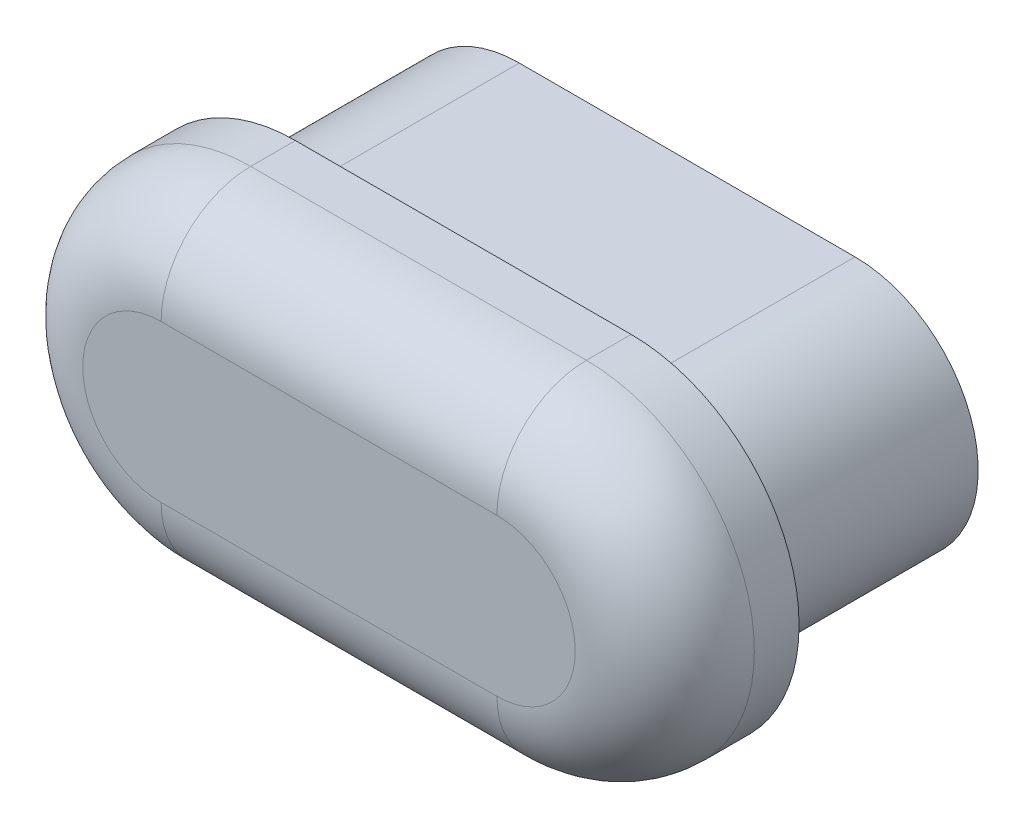
ISO-10303-21;
HEADER;
FILE_DESCRIPTION(('STEP AP214'),'2;1');
FILE_NAME('part.step','',(''),(''),'','','');
FILE_SCHEMA(('AUTOMOTIVE_DESIGN { 1 0 10303 214 1 1 1 1 }'));
ENDSEC;
DATA;
#1=APPLICATION_CONTEXT('core data for automotive mechanical design processes');
#2=APPLICATION_PROTOCOL_DEFINITION('international standard','automotive_design',2000,#1);
#3=PRODUCT_CONTEXT('',#1,'mechanical');
#4=PRODUCT('Part','Part','',(#3));
#5=PRODUCT_RELATED_PRODUCT_CATEGORY('part','',(#4));
#6=PRODUCT_DEFINITION_FORMATION('','',#4);
#7=PRODUCT_DEFINITION_CONTEXT('part definition',#1,'design');
#8=PRODUCT_DEFINITION('design','',#6,#7);
#9=PRODUCT_DEFINITION_SHAPE('','',#8);
#10=(LENGTH_UNIT() NAMED_UNIT(*) SI_UNIT(.MILLI.,.METRE.));
#11=(NAMED_UNIT(*) PLANE_ANGLE_UNIT() SI_UNIT($,.RADIAN.));
#12=(NAMED_UNIT(*) SI_UNIT($,.STERADIAN.) SOLID_ANGLE_UNIT());
#13=UNCERTAINTY_MEASURE_WITH_UNIT(LENGTH_MEASURE(1.E-05),#10,'distance_accuracy_value','');
#14=(GEOMETRIC_REPRESENTATION_CONTEXT(3) GLOBAL_UNCERTAINTY_ASSIGNED_CONTEXT((#13)) GLOBAL_UNIT_ASSIGNED_CONTEXT((#10,
#11,#12)) REPRESENTATION_CONTEXT('',''));
#15=CARTESIAN_POINT('',(0.,0.,0.));
#16=DIRECTION('',(0.,0.,1.));
#17=DIRECTION('',(1.,0.,0.));
#18=AXIS2_PLACEMENT_3D('',#15,#16,#17);
#19=CARTESIAN_POINT('',(-7.5,0.,0.));
#20=DIRECTION('',(0.,0.,1.));
#21=DIRECTION('',(1.,0.,0.));
#22=AXIS2_PLACEMENT_3D('',#19,#20,#21);
#23=PLANE('',#22);
#24=CARTESIAN_POINT('',(-7.5,0.,0.));
#25=DIRECTION('',(0.,0.,1.));
#26=DIRECTION('',(1.,0.,0.));
#27=AXIS2_PLACEMENT_3D('',#24,#25,#26);
#28=CIRCLE('',#27,7.5);
#29=CARTESIAN_POINT('',(-7.5,7.5,0.));
#30=VERTEX_POINT('',#29);
#31=CARTESIAN_POINT('',(-7.5,-7.5,0.));
#32=VERTEX_POINT('',#31);
#33=EDGE_CURVE('E139',#30,#32,#28,.T.);
#34=ORIENTED_EDGE('',*,*,#33,.F.);
#35=DIRECTION('',(-1.,0.,0.));
#36=VECTOR('',#35,1.);
#37=CARTESIAN_POINT('',(-7.5,7.5,0.));
#38=LINE('',#37,#36);
#39=CARTESIAN_POINT('',(7.5,7.5,0.));
#40=VERTEX_POINT('',#39);
#41=EDGE_CURVE('E153',#40,#30,#38,.T.);
#42=ORIENTED_EDGE('',*,*,#41,.F.);
#43=CARTESIAN_POINT('',(7.5,0.,0.));
#44=DIRECTION('',(0.,0.,1.));
#45=DIRECTION('',(1.,0.,0.));
#46=AXIS2_PLACEMENT_3D('',#43,#44,#45);
#47=CIRCLE('',#46,7.5);
#48=CARTESIAN_POINT('',(7.5,-7.5,0.));
#49=VERTEX_POINT('',#48);
#50=EDGE_CURVE('E150',#49,#40,#47,.T.);
#51=ORIENTED_EDGE('',*,*,#50,.F.);
#52=DIRECTION('',(1.,0.,0.));
#53=VECTOR('',#52,1.);
#54=CARTESIAN_POINT('',(-7.5,-7.5,0.));
#55=LINE('',#54,#53);
#56=EDGE_CURVE('E142',#32,#49,#55,.T.);
#57=ORIENTED_EDGE('',*,*,#56,.F.);
#58=EDGE_LOOP('',(#34,#42,#51,#57));
#59=FACE_BOUND('',#58,.T.);
#60=CARTESIAN_POINT('',(-7.5,0.,0.));
#61=DIRECTION('',(0.,0.,-1.));
#62=DIRECTION('',(-1.,0.,0.));
#63=AXIS2_PLACEMENT_3D('',#60,#61,#62);
#64=CIRCLE('',#63,5.5);
#65=CARTESIAN_POINT('',(-7.5,-5.5,0.));
#66=VERTEX_POINT('',#65);
#67=CARTESIAN_POINT('',(-7.5,5.5,0.));
#68=VERTEX_POINT('',#67);
#69=EDGE_CURVE('E138',#66,#68,#64,.T.);
#70=ORIENTED_EDGE('',*,*,#69,.F.);
#71=DIRECTION('',(-1.,0.,0.));
#72=VECTOR('',#71,1.);
#73=CARTESIAN_POINT('',(7.5,-5.5,0.));
#74=LINE('',#73,#72);
#75=CARTESIAN_POINT('',(7.5,-5.5,0.));
#76=VERTEX_POINT('',#75);
#77=EDGE_CURVE('E135',#76,#66,#74,.T.);
#78=ORIENTED_EDGE('',*,*,#77,.F.);
#79=CARTESIAN_POINT('',(7.5,0.,0.));
#80=DIRECTION('',(0.,0.,-1.));
#81=DIRECTION('',(-1.,0.,0.));
#82=AXIS2_PLACEMENT_3D('',#79,#80,#81);
#83=CIRCLE('',#82,5.5);
#84=CARTESIAN_POINT('',(7.5,5.5,0.));
#85=VERTEX_POINT('',#84);
#86=EDGE_CURVE('E193',#85,#76,#83,.T.);
#87=ORIENTED_EDGE('',*,*,#86,.F.);
#88=DIRECTION('',(1.,0.,0.));
#89=VECTOR('',#88,1.);
#90=CARTESIAN_POINT('',(-7.5,5.5,0.));
#91=LINE('',#90,#89);
#92=EDGE_CURVE('E191',#68,#85,#91,.T.);
#93=ORIENTED_EDGE('',*,*,#92,.F.);
#94=EDGE_LOOP('',(#70,#78,#87,#93));
#95=FACE_BOUND('',#94,.T.);
#96=ADVANCED_FACE('F36',(#59,#95),#23,.F.);
#97=CARTESIAN_POINT('',(-7.5,0.,6.));
#98=DIRECTION('',(0.,0.,-1.));
#99=DIRECTION('',(-1.,0.,0.));
#100=AXIS2_PLACEMENT_3D('',#97,#98,#99);
#101=CYLINDRICAL_SURFACE('',#100,7.5);
#102=DIRECTION('',(0.,0.,-1.));
#103=VECTOR('',#102,1.);
#104=CARTESIAN_POINT('',(-7.5,-7.5,6.));
#105=LINE('',#104,#103);
#106=CARTESIAN_POINT('',(-7.5,-7.5,2.));
#107=VERTEX_POINT('',#106);
#108=EDGE_CURVE('E162',#107,#32,#105,.T.);
#109=ORIENTED_EDGE('',*,*,#108,.F.);
#110=CARTESIAN_POINT('',(-7.5,0.,2.));
#111=DIRECTION('',(0.,0.,1.));
#112=DIRECTION('',(1.,0.,0.));
#113=AXIS2_PLACEMENT_3D('',#110,#111,#112);
#114=CIRCLE('',#113,7.5);
#115=CARTESIAN_POINT('',(-7.5,7.5,2.));
#116=VERTEX_POINT('',#115);
#117=EDGE_CURVE('E60',#107,#116,#114,.F.);
#118=ORIENTED_EDGE('',*,*,#117,.T.);
#119=DIRECTION('',(0.,0.,-1.));
#120=VECTOR('',#119,1.);
#121=CARTESIAN_POINT('',(-7.5,7.5,6.));
#122=LINE('',#121,#120);
#123=EDGE_CURVE('E156',#116,#30,#122,.T.);
#124=ORIENTED_EDGE('',*,*,#123,.T.);
#125=ORIENTED_EDGE('',*,*,#33,.T.);
#126=EDGE_LOOP('',(#109,#118,#124,#125));
#127=FACE_BOUND('',#126,.T.);
#128=ADVANCED_FACE('F211',(#127),#101,.T.);
#129=CARTESIAN_POINT('',(-7.5,-7.5,6.));
#130=DIRECTION('',(0.,1.,0.));
#131=DIRECTION('',(0.,0.,1.));
#132=AXIS2_PLACEMENT_3D('',#129,#130,#131);
#133=PLANE('',#132);
#134=DIRECTION('',(0.,0.,-1.));
#135=VECTOR('',#134,1.);
#136=CARTESIAN_POINT('',(7.5,-7.5,6.));
#137=LINE('',#136,#135);
#138=CARTESIAN_POINT('',(7.5,-7.5,2.));
#139=VERTEX_POINT('',#138);
#140=EDGE_CURVE('E160',#139,#49,#137,.T.);
#141=ORIENTED_EDGE('',*,*,#140,.F.);
#142=DIRECTION('',(1.,0.,0.));
#143=VECTOR('',#142,1.);
#144=CARTESIAN_POINT('',(-7.5,-7.5,2.));
#145=LINE('',#144,#143);
#146=EDGE_CURVE('E173',#139,#107,#145,.F.);
#147=ORIENTED_EDGE('',*,*,#146,.T.);
#148=ORIENTED_EDGE('',*,*,#108,.T.);
#149=ORIENTED_EDGE('',*,*,#56,.T.);
#150=EDGE_LOOP('',(#141,#147,#148,#149));
#151=FACE_BOUND('',#150,.T.);
#152=ADVANCED_FACE('F217',(#151),#133,.F.);
#153=CARTESIAN_POINT('',(7.5,0.,6.));
#154=DIRECTION('',(0.,0.,-1.));
#155=DIRECTION('',(-1.,0.,0.));
#156=AXIS2_PLACEMENT_3D('',#153,#154,#155);
#157=CYLINDRICAL_SURFACE('',#156,7.5);
#158=DIRECTION('',(0.,0.,-1.));
#159=VECTOR('',#158,1.);
#160=CARTESIAN_POINT('',(7.5,7.5,6.));
#161=LINE('',#160,#159);
#162=CARTESIAN_POINT('',(7.5,7.5,2.));
#163=VERTEX_POINT('',#162);
#164=EDGE_CURVE('E158',#163,#40,#161,.T.);
#165=ORIENTED_EDGE('',*,*,#164,.F.);
#166=CARTESIAN_POINT('',(7.5,0.,2.));
#167=DIRECTION('',(0.,0.,1.));
#168=DIRECTION('',(1.,0.,0.));
#169=AXIS2_PLACEMENT_3D('',#166,#167,#168);
#170=CIRCLE('',#169,7.5);
#171=EDGE_CURVE('E11',#163,#139,#170,.F.);
#172=ORIENTED_EDGE('',*,*,#171,.T.);
#173=ORIENTED_EDGE('',*,*,#140,.T.);
#174=ORIENTED_EDGE('',*,*,#50,.T.);
#175=EDGE_LOOP('',(#165,#172,#173,#174));
#176=FACE_BOUND('',#175,.T.);
#177=ADVANCED_FACE('F227',(#176),#157,.T.);
#178=CARTESIAN_POINT('',(-7.5,7.5,6.));
#179=DIRECTION('',(0.,-1.,0.));
#180=DIRECTION('',(0.,0.,-1.));
#181=AXIS2_PLACEMENT_3D('',#178,#179,#180);
#182=PLANE('',#181);
#183=ORIENTED_EDGE('',*,*,#123,.F.);
#184=DIRECTION('',(-1.,0.,0.));
#185=VECTOR('',#184,1.);
#186=CARTESIAN_POINT('',(7.5,7.5,2.));
#187=LINE('',#186,#185);
#188=EDGE_CURVE('E45',#116,#163,#187,.F.);
#189=ORIENTED_EDGE('',*,*,#188,.T.);
#190=ORIENTED_EDGE('',*,*,#164,.T.);
#191=ORIENTED_EDGE('',*,*,#41,.T.);
#192=EDGE_LOOP('',(#183,#189,#190,#191));
#193=FACE_BOUND('',#192,.T.);
#194=ADVANCED_FACE('F224',(#193),#182,.F.);
#195=CARTESIAN_POINT('',(-7.5,0.,6.));
#196=DIRECTION('',(0.,0.,1.));
#197=DIRECTION('',(1.,0.,0.));
#198=AXIS2_PLACEMENT_3D('',#195,#196,#197);
#199=PLANE('',#198);
#200=CARTESIAN_POINT('',(-7.5,0.,6.));
#201=DIRECTION('',(0.,0.,1.));
#202=DIRECTION('',(1.,0.,0.));
#203=AXIS2_PLACEMENT_3D('',#200,#201,#202);
#204=CIRCLE('',#203,3.5);
#205=CARTESIAN_POINT('',(-7.5,3.5,6.));
#206=VERTEX_POINT('',#205);
#207=CARTESIAN_POINT('',(-7.5,-3.5,6.));
#208=VERTEX_POINT('',#207);
#209=EDGE_CURVE('E168',#206,#208,#204,.T.);
#210=ORIENTED_EDGE('',*,*,#209,.T.);
#211=DIRECTION('',(1.,0.,0.));
#212=VECTOR('',#211,1.);
#213=CARTESIAN_POINT('',(7.5,-3.5,6.));
#214=LINE('',#213,#212);
#215=CARTESIAN_POINT('',(7.5,-3.5,6.));
#216=VERTEX_POINT('',#215);
#217=EDGE_CURVE('E170',#208,#216,#214,.T.);
#218=ORIENTED_EDGE('',*,*,#217,.T.);
#219=CARTESIAN_POINT('',(7.5,0.,6.));
#220=DIRECTION('',(0.,0.,1.));
#221=DIRECTION('',(1.,0.,0.));
#222=AXIS2_PLACEMENT_3D('',#219,#220,#221);
#223=CIRCLE('',#222,3.5);
#224=CARTESIAN_POINT('',(7.5,3.5,6.));
#225=VERTEX_POINT('',#224);
#226=EDGE_CURVE('E164',#216,#225,#223,.T.);
#227=ORIENTED_EDGE('',*,*,#226,.T.);
#228=DIRECTION('',(-1.,0.,0.));
#229=VECTOR('',#228,1.);
#230=CARTESIAN_POINT('',(-7.5,3.5,6.));
#231=LINE('',#230,#229);
#232=EDGE_CURVE('E166',#225,#206,#231,.T.);
#233=ORIENTED_EDGE('',*,*,#232,.T.);
#234=EDGE_LOOP('',(#210,#218,#227,#233));
#235=FACE_BOUND('',#234,.T.);
#236=ADVANCED_FACE('F222',(#235),#199,.T.);
#237=CARTESIAN_POINT('',(-7.5,0.,-10.));
#238=DIRECTION('',(0.,0.,1.));
#239=DIRECTION('',(1.,0.,0.));
#240=AXIS2_PLACEMENT_3D('',#237,#238,#239);
#241=CYLINDRICAL_SURFACE('',#240,5.5);
#242=ORIENTED_EDGE('',*,*,#69,.T.);
#243=DIRECTION('',(0.,0.,1.));
#244=VECTOR('',#243,1.);
#245=CARTESIAN_POINT('',(-7.5,5.5,-10.));
#246=LINE('',#245,#244);
#247=CARTESIAN_POINT('',(-7.5,5.5,-10.));
#248=VERTEX_POINT('',#247);
#249=EDGE_CURVE('E119',#248,#68,#246,.T.);
#250=ORIENTED_EDGE('',*,*,#249,.F.);
#251=CARTESIAN_POINT('',(-7.5,0.,-10.));
#252=DIRECTION('',(0.,0.,-1.));
#253=DIRECTION('',(-1.,0.,0.));
#254=AXIS2_PLACEMENT_3D('',#251,#252,#253);
#255=CIRCLE('',#254,5.5);
#256=CARTESIAN_POINT('',(-7.5,-5.5,-10.));
#257=VERTEX_POINT('',#256);
#258=EDGE_CURVE('E126',#257,#248,#255,.T.);
#259=ORIENTED_EDGE('',*,*,#258,.F.);
#260=DIRECTION('',(0.,0.,1.));
#261=VECTOR('',#260,1.);
#262=CARTESIAN_POINT('',(-7.5,-5.5,-10.));
#263=LINE('',#262,#261);
#264=EDGE_CURVE('E202',#257,#66,#263,.T.);
#265=ORIENTED_EDGE('',*,*,#264,.T.);
#266=EDGE_LOOP('',(#242,#250,#259,#265));
#267=FACE_BOUND('',#266,.T.);
#268=ADVANCED_FACE('F137',(#267),#241,.T.);
#269=CARTESIAN_POINT('',(-7.5,5.5,-10.));
#270=DIRECTION('',(0.,-1.,0.));
#271=DIRECTION('',(0.,0.,-1.));
#272=AXIS2_PLACEMENT_3D('',#269,#270,#271);
#273=PLANE('',#272);
#274=ORIENTED_EDGE('',*,*,#92,.T.);
#275=DIRECTION('',(0.,0.,1.));
#276=VECTOR('',#275,1.);
#277=CARTESIAN_POINT('',(7.5,5.5,-10.));
#278=LINE('',#277,#276);
#279=CARTESIAN_POINT('',(7.5,5.5,-10.));
#280=VERTEX_POINT('',#279);
#281=EDGE_CURVE('E122',#280,#85,#278,.T.);
#282=ORIENTED_EDGE('',*,*,#281,.F.);
#283=DIRECTION('',(1.,0.,0.));
#284=VECTOR('',#283,1.);
#285=CARTESIAN_POINT('',(-7.5,5.5,-10.));
#286=LINE('',#285,#284);
#287=EDGE_CURVE('E114',#248,#280,#286,.T.);
#288=ORIENTED_EDGE('',*,*,#287,.F.);
#289=ORIENTED_EDGE('',*,*,#249,.T.);
#290=EDGE_LOOP('',(#274,#282,#288,#289));
#291=FACE_BOUND('',#290,.T.);
#292=ADVANCED_FACE('F117',(#291),#273,.F.);
#293=CARTESIAN_POINT('',(7.5,0.,-10.));
#294=DIRECTION('',(0.,0.,1.));
#295=DIRECTION('',(1.,0.,0.));
#296=AXIS2_PLACEMENT_3D('',#293,#294,#295);
#297=CYLINDRICAL_SURFACE('',#296,5.5);
#298=ORIENTED_EDGE('',*,*,#86,.T.);
#299=DIRECTION('',(0.,0.,1.));
#300=VECTOR('',#299,1.);
#301=CARTESIAN_POINT('',(7.5,-5.5,-10.));
#302=LINE('',#301,#300);
#303=CARTESIAN_POINT('',(7.5,-5.5,-10.));
#304=VERTEX_POINT('',#303);
#305=EDGE_CURVE('E144',#304,#76,#302,.T.);
#306=ORIENTED_EDGE('',*,*,#305,.F.);
#307=CARTESIAN_POINT('',(7.5,0.,-10.));
#308=DIRECTION('',(0.,0.,-1.));
#309=DIRECTION('',(-1.,0.,0.));
#310=AXIS2_PLACEMENT_3D('',#307,#308,#309);
#311=CIRCLE('',#310,5.5);
#312=EDGE_CURVE('E125',#280,#304,#311,.T.);
#313=ORIENTED_EDGE('',*,*,#312,.F.);
#314=ORIENTED_EDGE('',*,*,#281,.T.);
#315=EDGE_LOOP('',(#298,#306,#313,#314));
#316=FACE_BOUND('',#315,.T.);
#317=ADVANCED_FACE('F208',(#316),#297,.T.);
#318=CARTESIAN_POINT('',(7.5,-5.5,-10.));
#319=DIRECTION('',(0.,1.,0.));
#320=DIRECTION('',(0.,0.,1.));
#321=AXIS2_PLACEMENT_3D('',#318,#319,#320);
#322=PLANE('',#321);
#323=ORIENTED_EDGE('',*,*,#77,.T.);
#324=ORIENTED_EDGE('',*,*,#264,.F.);
#325=DIRECTION('',(-1.,0.,0.));
#326=VECTOR('',#325,1.);
#327=CARTESIAN_POINT('',(7.5,-5.5,-10.));
#328=LINE('',#327,#326);
#329=EDGE_CURVE('E131',#304,#257,#328,.T.);
#330=ORIENTED_EDGE('',*,*,#329,.F.);
#331=ORIENTED_EDGE('',*,*,#305,.T.);
#332=EDGE_LOOP('',(#323,#324,#330,#331));
#333=FACE_BOUND('',#332,.T.);
#334=ADVANCED_FACE('F206',(#333),#322,.F.);
#335=CARTESIAN_POINT('',(-7.5,0.,-10.));
#336=DIRECTION('',(0.,0.,-1.));
#337=DIRECTION('',(-1.,0.,0.));
#338=AXIS2_PLACEMENT_3D('',#335,#336,#337);
#339=PLANE('',#338);
#340=ORIENTED_EDGE('',*,*,#258,.T.);
#341=ORIENTED_EDGE('',*,*,#287,.T.);
#342=ORIENTED_EDGE('',*,*,#312,.T.);
#343=ORIENTED_EDGE('',*,*,#329,.T.);
#344=EDGE_LOOP('',(#340,#341,#342,#343));
#345=FACE_BOUND('',#344,.T.);
#346=ADVANCED_FACE('F129',(#345),#339,.T.);
#347=CARTESIAN_POINT('',(-7.5,3.5,2.));
#348=DIRECTION('',(1.,0.,0.));
#349=DIRECTION('',(0.,0.,-1.));
#350=AXIS2_PLACEMENT_3D('',#347,#348,#349);
#351=CYLINDRICAL_SURFACE('',#350,4.);
#352=CARTESIAN_POINT('',(7.5,3.5,2.));
#353=DIRECTION('',(1.,0.,0.));
#354=DIRECTION('',(0.,0.,-1.));
#355=AXIS2_PLACEMENT_3D('',#352,#353,#354);
#356=CIRCLE('',#355,4.);
#357=EDGE_CURVE('E181',#163,#225,#356,.T.);
#358=ORIENTED_EDGE('',*,*,#357,.F.);
#359=ORIENTED_EDGE('',*,*,#188,.F.);
#360=CARTESIAN_POINT('',(-7.5,3.5,2.));
#361=DIRECTION('',(-1.,0.,0.));
#362=DIRECTION('',(0.,0.,1.));
#363=AXIS2_PLACEMENT_3D('',#360,#361,#362);
#364=CIRCLE('',#363,4.);
#365=EDGE_CURVE('E40',#206,#116,#364,.T.);
#366=ORIENTED_EDGE('',*,*,#365,.F.);
#367=ORIENTED_EDGE('',*,*,#232,.F.);
#368=EDGE_LOOP('',(#358,#359,#366,#367));
#369=FACE_BOUND('',#368,.T.);
#370=ADVANCED_FACE('F38',(#369),#351,.T.);
#371=CARTESIAN_POINT('',(-7.5,0.,2.));
#372=DIRECTION('',(0.,0.,1.));
#373=DIRECTION('',(1.,0.,0.));
#374=AXIS2_PLACEMENT_3D('',#371,#372,#373);
#375=DEGENERATE_TOROIDAL_SURFACE('',#374,3.5,4.,.T.);
#376=ORIENTED_EDGE('',*,*,#365,.T.);
#377=ORIENTED_EDGE('',*,*,#117,.F.);
#378=CARTESIAN_POINT('',(-7.5,-3.5,2.));
#379=DIRECTION('',(1.,0.,0.));
#380=DIRECTION('',(0.,0.,-1.));
#381=AXIS2_PLACEMENT_3D('',#378,#379,#380);
#382=CIRCLE('',#381,4.);
#383=EDGE_CURVE('E180',#208,#107,#382,.T.);
#384=ORIENTED_EDGE('',*,*,#383,.F.);
#385=ORIENTED_EDGE('',*,*,#209,.F.);
#386=EDGE_LOOP('',(#376,#377,#384,#385));
#387=FACE_BOUND('',#386,.T.);
#388=ADVANCED_FACE('F240',(#387),#375,.T.);
#389=CARTESIAN_POINT('',(7.5,0.,2.));
#390=DIRECTION('',(0.,0.,1.));
#391=DIRECTION('',(1.,0.,0.));
#392=AXIS2_PLACEMENT_3D('',#389,#390,#391);
#393=DEGENERATE_TOROIDAL_SURFACE('',#392,3.5,4.,.T.);
#394=ORIENTED_EDGE('',*,*,#357,.T.);
#395=ORIENTED_EDGE('',*,*,#226,.F.);
#396=CARTESIAN_POINT('',(7.5,-3.5,2.));
#397=DIRECTION('',(-1.,0.,0.));
#398=DIRECTION('',(0.,0.,1.));
#399=AXIS2_PLACEMENT_3D('',#396,#397,#398);
#400=CIRCLE('',#399,4.);
#401=EDGE_CURVE('E178',#139,#216,#400,.T.);
#402=ORIENTED_EDGE('',*,*,#401,.F.);
#403=ORIENTED_EDGE('',*,*,#171,.F.);
#404=EDGE_LOOP('',(#394,#395,#402,#403));
#405=FACE_BOUND('',#404,.T.);
#406=ADVANCED_FACE('F237',(#405),#393,.T.);
#407=CARTESIAN_POINT('',(-7.5,-3.5,2.));
#408=DIRECTION('',(-1.,0.,0.));
#409=DIRECTION('',(0.,0.,1.));
#410=AXIS2_PLACEMENT_3D('',#407,#408,#409);
#411=CYLINDRICAL_SURFACE('',#410,4.);
#412=ORIENTED_EDGE('',*,*,#383,.T.);
#413=ORIENTED_EDGE('',*,*,#146,.F.);
#414=ORIENTED_EDGE('',*,*,#401,.T.);
#415=ORIENTED_EDGE('',*,*,#217,.F.);
#416=EDGE_LOOP('',(#412,#413,#414,#415));
#417=FACE_BOUND('',#416,.T.);
#418=ADVANCED_FACE('F234',(#417),#411,.T.);
#419=CLOSED_SHELL('',(#96,#128,#152,#177,#194,#236,#268,#292,#317,#334,#346,#370,#388,#406,#418));
#420=MANIFOLD_SOLID_BREP('B2',#419);
#421=ADVANCED_BREP_SHAPE_REPRESENTATION('',(#18,#420),#14);
#422=SHAPE_DEFINITION_REPRESENTATION(#9,#421);
ENDSEC;
END-ISO-10303-21;
